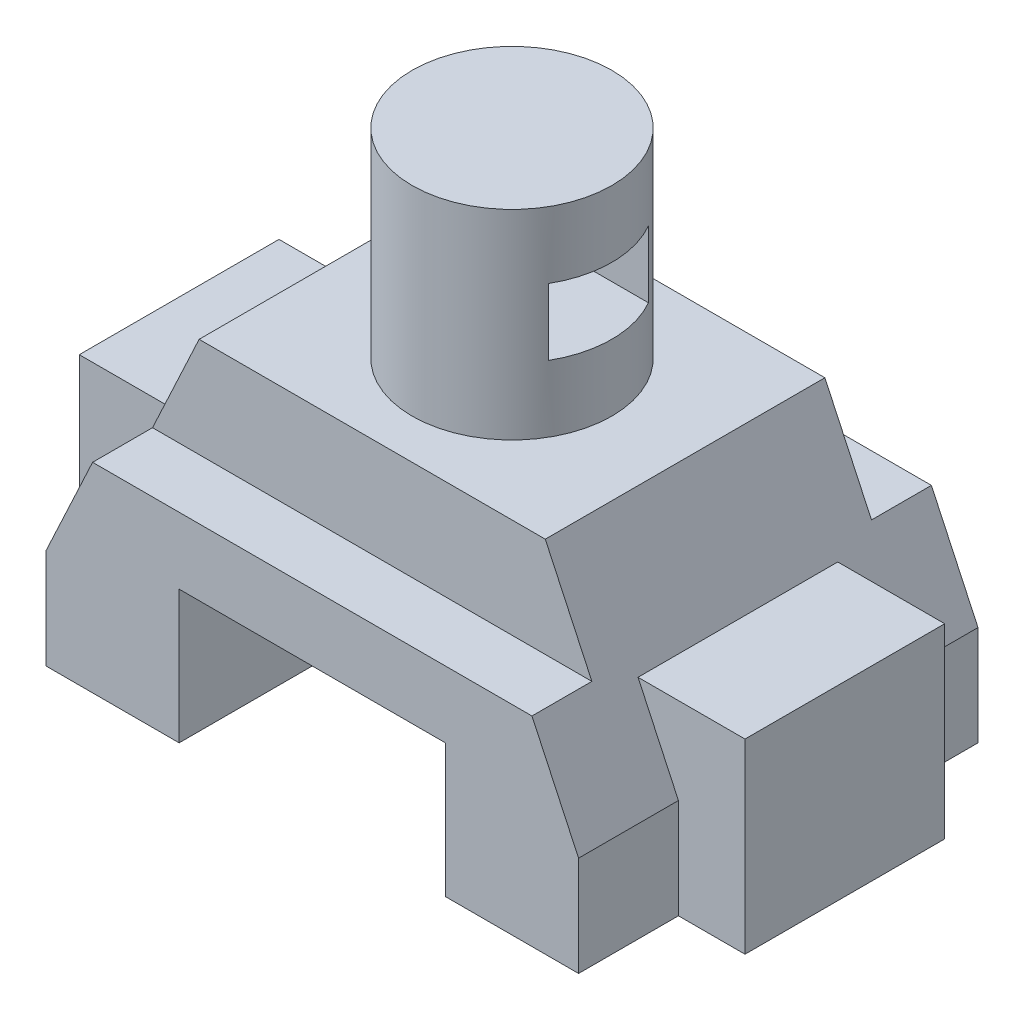
ISO-10303-21;
HEADER;
FILE_DESCRIPTION(('STEP AP214'),'2;1');
FILE_NAME('part.step','',(''),(''),'','','');
FILE_SCHEMA(('AUTOMOTIVE_DESIGN { 1 0 10303 214 1 1 1 1 }'));
ENDSEC;
DATA;
#1=APPLICATION_CONTEXT('core data for automotive mechanical design processes');
#2=APPLICATION_PROTOCOL_DEFINITION('international standard','automotive_design',2000,#1);
#3=PRODUCT_CONTEXT('',#1,'mechanical');
#4=PRODUCT('Part','Part','',(#3));
#5=PRODUCT_RELATED_PRODUCT_CATEGORY('part','',(#4));
#6=PRODUCT_DEFINITION_FORMATION('','',#4);
#7=PRODUCT_DEFINITION_CONTEXT('part definition',#1,'design');
#8=PRODUCT_DEFINITION('design','',#6,#7);
#9=PRODUCT_DEFINITION_SHAPE('','',#8);
#10=(LENGTH_UNIT() NAMED_UNIT(*) SI_UNIT(.MILLI.,.METRE.));
#11=(NAMED_UNIT(*) PLANE_ANGLE_UNIT() SI_UNIT($,.RADIAN.));
#12=(NAMED_UNIT(*) SI_UNIT($,.STERADIAN.) SOLID_ANGLE_UNIT());
#13=UNCERTAINTY_MEASURE_WITH_UNIT(LENGTH_MEASURE(1.E-05),#10,'distance_accuracy_value','');
#14=(GEOMETRIC_REPRESENTATION_CONTEXT(3) GLOBAL_UNCERTAINTY_ASSIGNED_CONTEXT((#13)) GLOBAL_UNIT_ASSIGNED_CONTEXT((#10,
#11,#12)) REPRESENTATION_CONTEXT('',''));
#15=CARTESIAN_POINT('',(0.,0.,0.));
#16=DIRECTION('',(0.,0.,1.));
#17=DIRECTION('',(1.,0.,0.));
#18=AXIS2_PLACEMENT_3D('',#15,#16,#17);
#19=CARTESIAN_POINT('',(40.,0.,60.));
#20=DIRECTION('',(0.,1.,0.));
#21=DIRECTION('',(-1.,0.,0.));
#22=AXIS2_PLACEMENT_3D('',#19,#20,#21);
#23=PLANE('',#22);
#24=DIRECTION('',(0.,0.,-1.));
#25=VECTOR('',#24,1.);
#26=CARTESIAN_POINT('',(20.,0.,60.));
#27=LINE('',#26,#25);
#28=CARTESIAN_POINT('',(20.,0.,60.));
#29=VERTEX_POINT('',#28);
#30=CARTESIAN_POINT('',(20.,0.,0.));
#31=VERTEX_POINT('',#30);
#32=EDGE_CURVE('E282',#29,#31,#27,.T.);
#33=ORIENTED_EDGE('',*,*,#32,.T.);
#34=DIRECTION('',(1.,0.,0.));
#35=VECTOR('',#34,1.);
#36=CARTESIAN_POINT('',(40.,0.,0.));
#37=LINE('',#36,#35);
#38=CARTESIAN_POINT('',(40.,0.,0.));
#39=VERTEX_POINT('',#38);
#40=EDGE_CURVE('E288',#31,#39,#37,.T.);
#41=ORIENTED_EDGE('',*,*,#40,.T.);
#42=DIRECTION('',(0.,0.,-1.));
#43=VECTOR('',#42,1.);
#44=CARTESIAN_POINT('',(40.,0.,60.));
#45=LINE('',#44,#43);
#46=CARTESIAN_POINT('',(40.,0.,15.));
#47=VERTEX_POINT('',#46);
#48=EDGE_CURVE('E287',#47,#39,#45,.T.);
#49=ORIENTED_EDGE('',*,*,#48,.F.);
#50=DIRECTION('',(1.,0.,0.));
#51=VECTOR('',#50,1.);
#52=CARTESIAN_POINT('',(-50.,0.,15.));
#53=LINE('',#52,#51);
#54=CARTESIAN_POINT('',(50.,0.,15.));
#55=VERTEX_POINT('',#54);
#56=EDGE_CURVE('E396',#47,#55,#53,.T.);
#57=ORIENTED_EDGE('',*,*,#56,.T.);
#58=DIRECTION('',(0.,0.,-1.));
#59=VECTOR('',#58,1.);
#60=CARTESIAN_POINT('',(50.,0.,45.));
#61=LINE('',#60,#59);
#62=CARTESIAN_POINT('',(50.,0.,45.));
#63=VERTEX_POINT('',#62);
#64=EDGE_CURVE('E425',#63,#55,#61,.T.);
#65=ORIENTED_EDGE('',*,*,#64,.F.);
#66=DIRECTION('',(1.,0.,0.));
#67=VECTOR('',#66,1.);
#68=CARTESIAN_POINT('',(-50.,0.,45.));
#69=LINE('',#68,#67);
#70=CARTESIAN_POINT('',(40.,0.,45.));
#71=VERTEX_POINT('',#70);
#72=EDGE_CURVE('E397',#71,#63,#69,.T.);
#73=ORIENTED_EDGE('',*,*,#72,.F.);
#74=CARTESIAN_POINT('',(40.,0.,60.));
#75=VERTEX_POINT('',#74);
#76=EDGE_CURVE('E284',#75,#71,#45,.T.);
#77=ORIENTED_EDGE('',*,*,#76,.F.);
#78=DIRECTION('',(1.,0.,0.));
#79=VECTOR('',#78,1.);
#80=CARTESIAN_POINT('',(40.,0.,60.));
#81=LINE('',#80,#79);
#82=EDGE_CURVE('E317',#29,#75,#81,.T.);
#83=ORIENTED_EDGE('',*,*,#82,.F.);
#84=EDGE_LOOP('',(#33,#41,#49,#57,#65,#73,#77,#83));
#85=FACE_BOUND('',#84,.T.);
#86=ADVANCED_FACE('F33',(#85),#23,.F.);
#87=CARTESIAN_POINT('',(40.,15.,60.));
#88=DIRECTION('',(-1.,0.,0.));
#89=DIRECTION('',(0.,0.,1.));
#90=AXIS2_PLACEMENT_3D('',#87,#88,#89);
#91=PLANE('',#90);
#92=ORIENTED_EDGE('',*,*,#76,.T.);
#93=DIRECTION('',(0.,1.,0.));
#94=VECTOR('',#93,1.);
#95=CARTESIAN_POINT('',(40.,15.,45.));
#96=LINE('',#95,#94);
#97=CARTESIAN_POINT('',(40.,15.,45.));
#98=VERTEX_POINT('',#97);
#99=EDGE_CURVE('E369',#71,#98,#96,.T.);
#100=ORIENTED_EDGE('',*,*,#99,.T.);
#101=DIRECTION('',(0.,0.,-1.));
#102=VECTOR('',#101,1.);
#103=CARTESIAN_POINT('',(40.,15.,60.));
#104=LINE('',#103,#102);
#105=CARTESIAN_POINT('',(40.,15.,60.));
#106=VERTEX_POINT('',#105);
#107=EDGE_CURVE('E258',#106,#98,#104,.T.);
#108=ORIENTED_EDGE('',*,*,#107,.F.);
#109=DIRECTION('',(0.,1.,0.));
#110=VECTOR('',#109,1.);
#111=CARTESIAN_POINT('',(40.,15.,60.));
#112=LINE('',#111,#110);
#113=EDGE_CURVE('E291',#75,#106,#112,.T.);
#114=ORIENTED_EDGE('',*,*,#113,.F.);
#115=EDGE_LOOP('',(#92,#100,#108,#114));
#116=FACE_BOUND('',#115,.T.);
#117=ADVANCED_FACE('F510',(#116),#91,.F.);
#118=CARTESIAN_POINT('',(-40.,0.,60.));
#119=DIRECTION('',(1.,0.,0.));
#120=DIRECTION('',(0.,0.,-1.));
#121=AXIS2_PLACEMENT_3D('',#118,#119,#120);
#122=PLANE('',#121);
#123=DIRECTION('',(0.,0.,-1.));
#124=VECTOR('',#123,1.);
#125=CARTESIAN_POINT('',(-40.,15.,60.));
#126=LINE('',#125,#124);
#127=CARTESIAN_POINT('',(-40.,15.,60.));
#128=VERTEX_POINT('',#127);
#129=CARTESIAN_POINT('',(-40.,15.,45.));
#130=VERTEX_POINT('',#129);
#131=EDGE_CURVE('E268',#128,#130,#126,.T.);
#132=ORIENTED_EDGE('',*,*,#131,.T.);
#133=DIRECTION('',(0.,-1.,0.));
#134=VECTOR('',#133,1.);
#135=CARTESIAN_POINT('',(-40.,0.,45.));
#136=LINE('',#135,#134);
#137=CARTESIAN_POINT('',(-40.,0.,45.));
#138=VERTEX_POINT('',#137);
#139=EDGE_CURVE('E378',#130,#138,#136,.T.);
#140=ORIENTED_EDGE('',*,*,#139,.T.);
#141=DIRECTION('',(0.,0.,-1.));
#142=VECTOR('',#141,1.);
#143=CARTESIAN_POINT('',(-40.,0.,60.));
#144=LINE('',#143,#142);
#145=CARTESIAN_POINT('',(-40.,0.,60.));
#146=VERTEX_POINT('',#145);
#147=EDGE_CURVE('E272',#146,#138,#144,.T.);
#148=ORIENTED_EDGE('',*,*,#147,.F.);
#149=DIRECTION('',(0.,-1.,0.));
#150=VECTOR('',#149,1.);
#151=CARTESIAN_POINT('',(-40.,0.,60.));
#152=LINE('',#151,#150);
#153=EDGE_CURVE('E327',#128,#146,#152,.T.);
#154=ORIENTED_EDGE('',*,*,#153,.F.);
#155=EDGE_LOOP('',(#132,#140,#148,#154));
#156=FACE_BOUND('',#155,.T.);
#157=ADVANCED_FACE('F497',(#156),#122,.F.);
#158=CARTESIAN_POINT('',(0.,0.,0.));
#159=DIRECTION('',(0.,0.,-1.));
#160=DIRECTION('',(-1.,0.,0.));
#161=AXIS2_PLACEMENT_3D('',#158,#159,#160);
#162=PLANE('',#161);
#163=DIRECTION('',(-0.422885465331124,-0.906183139995265,0.));
#164=VECTOR('',#163,1.);
#165=CARTESIAN_POINT('',(-40.,15.,0.));
#166=LINE('',#165,#164);
#167=CARTESIAN_POINT('',(-33.,30.,0.));
#168=VERTEX_POINT('',#167);
#169=CARTESIAN_POINT('',(-40.,15.,0.));
#170=VERTEX_POINT('',#169);
#171=EDGE_CURVE('E307',#168,#170,#166,.T.);
#172=ORIENTED_EDGE('',*,*,#171,.F.);
#173=DIRECTION('',(1.,0.,0.));
#174=VECTOR('',#173,1.);
#175=CARTESIAN_POINT('',(0.,30.,0.));
#176=LINE('',#175,#174);
#177=CARTESIAN_POINT('',(33.,30.,0.));
#178=VERTEX_POINT('',#177);
#179=EDGE_CURVE('E255',#168,#178,#176,.T.);
#180=ORIENTED_EDGE('',*,*,#179,.T.);
#181=DIRECTION('',(-0.422885465331124,0.906183139995265,0.));
#182=VECTOR('',#181,1.);
#183=CARTESIAN_POINT('',(26.,45.,0.));
#184=LINE('',#183,#182);
#185=CARTESIAN_POINT('',(40.,15.,0.));
#186=VERTEX_POINT('',#185);
#187=EDGE_CURVE('E310',#186,#178,#184,.T.);
#188=ORIENTED_EDGE('',*,*,#187,.F.);
#189=DIRECTION('',(0.,1.,0.));
#190=VECTOR('',#189,1.);
#191=CARTESIAN_POINT('',(40.,15.,0.));
#192=LINE('',#191,#190);
#193=EDGE_CURVE('E313',#39,#186,#192,.T.);
#194=ORIENTED_EDGE('',*,*,#193,.F.);
#195=ORIENTED_EDGE('',*,*,#40,.F.);
#196=DIRECTION('',(0.,-1.,0.));
#197=VECTOR('',#196,1.);
#198=CARTESIAN_POINT('',(20.,20.,0.));
#199=LINE('',#198,#197);
#200=CARTESIAN_POINT('',(20.,20.,0.));
#201=VERTEX_POINT('',#200);
#202=EDGE_CURVE('E292',#201,#31,#199,.T.);
#203=ORIENTED_EDGE('',*,*,#202,.F.);
#204=DIRECTION('',(1.,0.,0.));
#205=VECTOR('',#204,1.);
#206=CARTESIAN_POINT('',(-20.,20.,0.));
#207=LINE('',#206,#205);
#208=CARTESIAN_POINT('',(-20.,20.,0.));
#209=VERTEX_POINT('',#208);
#210=EDGE_CURVE('E295',#209,#201,#207,.T.);
#211=ORIENTED_EDGE('',*,*,#210,.F.);
#212=DIRECTION('',(0.,1.,0.));
#213=VECTOR('',#212,1.);
#214=CARTESIAN_POINT('',(-20.,0.,0.));
#215=LINE('',#214,#213);
#216=CARTESIAN_POINT('',(-20.,0.,0.));
#217=VERTEX_POINT('',#216);
#218=EDGE_CURVE('E298',#217,#209,#215,.T.);
#219=ORIENTED_EDGE('',*,*,#218,.F.);
#220=DIRECTION('',(1.,0.,0.));
#221=VECTOR('',#220,1.);
#222=CARTESIAN_POINT('',(-20.,0.,0.));
#223=LINE('',#222,#221);
#224=CARTESIAN_POINT('',(-40.,0.,0.));
#225=VERTEX_POINT('',#224);
#226=EDGE_CURVE('E301',#225,#217,#223,.T.);
#227=ORIENTED_EDGE('',*,*,#226,.F.);
#228=DIRECTION('',(0.,-1.,0.));
#229=VECTOR('',#228,1.);
#230=CARTESIAN_POINT('',(-40.,0.,0.));
#231=LINE('',#230,#229);
#232=EDGE_CURVE('E304',#170,#225,#231,.T.);
#233=ORIENTED_EDGE('',*,*,#232,.F.);
#234=EDGE_LOOP('',(#172,#180,#188,#194,#195,#203,#211,#219,#227,#233));
#235=FACE_BOUND('',#234,.T.);
#236=ADVANCED_FACE('F472',(#235),#162,.T.);
#237=CARTESIAN_POINT('',(40.,15.,15.));
#238=VERTEX_POINT('',#237);
#239=EDGE_CURVE('E261',#238,#186,#104,.T.);
#240=ORIENTED_EDGE('',*,*,#239,.F.);
#241=DIRECTION('',(0.,-1.,0.));
#242=VECTOR('',#241,1.);
#243=CARTESIAN_POINT('',(40.,15.,15.));
#244=LINE('',#243,#242);
#245=EDGE_CURVE('E381',#238,#47,#244,.T.);
#246=ORIENTED_EDGE('',*,*,#245,.T.);
#247=ORIENTED_EDGE('',*,*,#48,.T.);
#248=ORIENTED_EDGE('',*,*,#193,.T.);
#249=EDGE_LOOP('',(#240,#246,#247,#248));
#250=FACE_BOUND('',#249,.T.);
#251=ADVANCED_FACE('F35',(#250),#91,.F.);
#252=CARTESIAN_POINT('',(26.,45.,60.));
#253=DIRECTION('',(-0.906183139995265,-0.422885465331124,0.));
#254=DIRECTION('',(0.422885465331124,-0.906183139995265,0.));
#255=AXIS2_PLACEMENT_3D('',#252,#253,#254);
#256=PLANE('',#255);
#257=ORIENTED_EDGE('',*,*,#107,.T.);
#258=DIRECTION('',(-0.422885465331124,0.906183139995265,0.));
#259=VECTOR('',#258,1.);
#260=CARTESIAN_POINT('',(26.,45.,45.));
#261=LINE('',#260,#259);
#262=CARTESIAN_POINT('',(33.9333333333333,28.,45.));
#263=VERTEX_POINT('',#262);
#264=EDGE_CURVE('E372',#98,#263,#261,.T.);
#265=ORIENTED_EDGE('',*,*,#264,.T.);
#266=DIRECTION('',(0.,0.,-1.));
#267=VECTOR('',#266,1.);
#268=CARTESIAN_POINT('',(33.9333333333333,28.,60.));
#269=LINE('',#268,#267);
#270=CARTESIAN_POINT('',(33.9333333333333,28.,15.));
#271=VERTEX_POINT('',#270);
#272=EDGE_CURVE('E366',#263,#271,#269,.T.);
#273=ORIENTED_EDGE('',*,*,#272,.T.);
#274=DIRECTION('',(0.422885465331124,-0.906183139995265,0.));
#275=VECTOR('',#274,1.);
#276=CARTESIAN_POINT('',(26.,45.,15.));
#277=LINE('',#276,#275);
#278=EDGE_CURVE('E384',#271,#238,#277,.T.);
#279=ORIENTED_EDGE('',*,*,#278,.T.);
#280=ORIENTED_EDGE('',*,*,#239,.T.);
#281=ORIENTED_EDGE('',*,*,#187,.T.);
#282=DIRECTION('',(0.,0.,-1.));
#283=VECTOR('',#282,1.);
#284=CARTESIAN_POINT('',(33.,30.,60.));
#285=LINE('',#284,#283);
#286=CARTESIAN_POINT('',(33.,30.,9.));
#287=VERTEX_POINT('',#286);
#288=EDGE_CURVE('E347',#287,#178,#285,.T.);
#289=ORIENTED_EDGE('',*,*,#288,.F.);
#290=DIRECTION('',(-0.422885465331124,0.906183139995265,0.));
#291=VECTOR('',#290,1.);
#292=CARTESIAN_POINT('',(26.,45.,9.));
#293=LINE('',#292,#291);
#294=CARTESIAN_POINT('',(26.,45.,9.));
#295=VERTEX_POINT('',#294);
#296=EDGE_CURVE('E316',#287,#295,#293,.T.);
#297=ORIENTED_EDGE('',*,*,#296,.T.);
#298=DIRECTION('',(0.,0.,-1.));
#299=VECTOR('',#298,1.);
#300=CARTESIAN_POINT('',(26.,45.,60.));
#301=LINE('',#300,#299);
#302=CARTESIAN_POINT('',(26.,45.,51.));
#303=VERTEX_POINT('',#302);
#304=EDGE_CURVE('E262',#303,#295,#301,.T.);
#305=ORIENTED_EDGE('',*,*,#304,.F.);
#306=DIRECTION('',(0.422885465331124,-0.906183139995265,0.));
#307=VECTOR('',#306,1.);
#308=CARTESIAN_POINT('',(26.,45.,51.));
#309=LINE('',#308,#307);
#310=CARTESIAN_POINT('',(33.,30.,51.));
#311=VERTEX_POINT('',#310);
#312=EDGE_CURVE('E338',#303,#311,#309,.T.);
#313=ORIENTED_EDGE('',*,*,#312,.T.);
#314=DIRECTION('',(0.,0.,1.));
#315=VECTOR('',#314,1.);
#316=CARTESIAN_POINT('',(33.,30.,60.));
#317=LINE('',#316,#315);
#318=CARTESIAN_POINT('',(33.,30.,60.));
#319=VERTEX_POINT('',#318);
#320=EDGE_CURVE('E341',#311,#319,#317,.T.);
#321=ORIENTED_EDGE('',*,*,#320,.T.);
#322=DIRECTION('',(-0.422885465331124,0.906183139995265,0.));
#323=VECTOR('',#322,1.);
#324=CARTESIAN_POINT('',(26.,45.,60.));
#325=LINE('',#324,#323);
#326=EDGE_CURVE('E331',#106,#319,#325,.T.);
#327=ORIENTED_EDGE('',*,*,#326,.F.);
#328=EDGE_LOOP('',(#257,#265,#273,#279,#280,#281,#289,#297,#305,#313,#321,#327));
#329=FACE_BOUND('',#328,.T.);
#330=ADVANCED_FACE('F453',(#329),#256,.F.);
#331=CARTESIAN_POINT('',(-26.,45.,60.));
#332=DIRECTION('',(0.,-1.,0.));
#333=DIRECTION('',(0.,0.,-1.));
#334=AXIS2_PLACEMENT_3D('',#331,#332,#333);
#335=PLANE('',#334);
#336=CARTESIAN_POINT('',(0.,45.,30.));
#337=DIRECTION('',(0.,1.,0.));
#338=DIRECTION('',(0.,0.,1.));
#339=AXIS2_PLACEMENT_3D('',#336,#337,#338);
#340=CIRCLE('',#339,15.);
#341=CARTESIAN_POINT('',(0.,45.,45.));
#342=VERTEX_POINT('',#341);
#343=EDGE_CURVE('E245',#342,#342,#340,.T.);
#344=ORIENTED_EDGE('',*,*,#343,.F.);
#345=EDGE_LOOP('',(#344));
#346=FACE_BOUND('',#345,.T.);
#347=ORIENTED_EDGE('',*,*,#304,.T.);
#348=DIRECTION('',(1.,0.,0.));
#349=VECTOR('',#348,1.);
#350=CARTESIAN_POINT('',(-40.,45.,9.));
#351=LINE('',#350,#349);
#352=CARTESIAN_POINT('',(-26.,45.,9.));
#353=VERTEX_POINT('',#352);
#354=EDGE_CURVE('E358',#353,#295,#351,.T.);
#355=ORIENTED_EDGE('',*,*,#354,.F.);
#356=DIRECTION('',(0.,0.,-1.));
#357=VECTOR('',#356,1.);
#358=CARTESIAN_POINT('',(-26.,45.,60.));
#359=LINE('',#358,#357);
#360=CARTESIAN_POINT('',(-26.,45.,51.));
#361=VERTEX_POINT('',#360);
#362=EDGE_CURVE('E265',#361,#353,#359,.T.);
#363=ORIENTED_EDGE('',*,*,#362,.F.);
#364=DIRECTION('',(-1.,0.,0.));
#365=VECTOR('',#364,1.);
#366=CARTESIAN_POINT('',(-40.,45.,51.));
#367=LINE('',#366,#365);
#368=EDGE_CURVE('E352',#303,#361,#367,.T.);
#369=ORIENTED_EDGE('',*,*,#368,.F.);
#370=EDGE_LOOP('',(#347,#355,#363,#369));
#371=FACE_BOUND('',#370,.T.);
#372=ADVANCED_FACE('F449',(#346,#371),#335,.F.);
#373=CARTESIAN_POINT('',(-40.,15.,60.));
#374=DIRECTION('',(0.906183139995265,-0.422885465331124,0.));
#375=DIRECTION('',(0.422885465331124,0.906183139995265,0.));
#376=AXIS2_PLACEMENT_3D('',#373,#374,#375);
#377=PLANE('',#376);
#378=DIRECTION('',(0.,0.,1.));
#379=VECTOR('',#378,1.);
#380=CARTESIAN_POINT('',(-33.9333333333333,28.,60.));
#381=LINE('',#380,#379);
#382=CARTESIAN_POINT('',(-33.9333333333333,28.,15.));
#383=VERTEX_POINT('',#382);
#384=CARTESIAN_POINT('',(-33.9333333333333,28.,45.));
#385=VERTEX_POINT('',#384);
#386=EDGE_CURVE('E242',#383,#385,#381,.T.);
#387=ORIENTED_EDGE('',*,*,#386,.T.);
#388=DIRECTION('',(-0.422885465331124,-0.906183139995265,0.));
#389=VECTOR('',#388,1.);
#390=CARTESIAN_POINT('',(-40.,15.,45.));
#391=LINE('',#390,#389);
#392=EDGE_CURVE('E375',#385,#130,#391,.T.);
#393=ORIENTED_EDGE('',*,*,#392,.T.);
#394=ORIENTED_EDGE('',*,*,#131,.F.);
#395=DIRECTION('',(-0.422885465331124,-0.906183139995265,0.));
#396=VECTOR('',#395,1.);
#397=CARTESIAN_POINT('',(-40.,15.,60.));
#398=LINE('',#397,#396);
#399=CARTESIAN_POINT('',(-33.,30.,60.));
#400=VERTEX_POINT('',#399);
#401=EDGE_CURVE('E329',#400,#128,#398,.T.);
#402=ORIENTED_EDGE('',*,*,#401,.F.);
#403=DIRECTION('',(0.,0.,-1.));
#404=VECTOR('',#403,1.);
#405=CARTESIAN_POINT('',(-33.,30.,60.));
#406=LINE('',#405,#404);
#407=CARTESIAN_POINT('',(-33.,30.,51.));
#408=VERTEX_POINT('',#407);
#409=EDGE_CURVE('E344',#400,#408,#406,.T.);
#410=ORIENTED_EDGE('',*,*,#409,.T.);
#411=DIRECTION('',(0.422885465331124,0.906183139995265,0.));
#412=VECTOR('',#411,1.);
#413=CARTESIAN_POINT('',(-40.,15.,51.));
#414=LINE('',#413,#412);
#415=EDGE_CURVE('E249',#408,#361,#414,.T.);
#416=ORIENTED_EDGE('',*,*,#415,.T.);
#417=ORIENTED_EDGE('',*,*,#362,.T.);
#418=DIRECTION('',(-0.422885465331124,-0.906183139995265,0.));
#419=VECTOR('',#418,1.);
#420=CARTESIAN_POINT('',(-40.,15.,9.));
#421=LINE('',#420,#419);
#422=CARTESIAN_POINT('',(-33.,30.,9.));
#423=VERTEX_POINT('',#422);
#424=EDGE_CURVE('E246',#353,#423,#421,.T.);
#425=ORIENTED_EDGE('',*,*,#424,.T.);
#426=DIRECTION('',(0.,0.,1.));
#427=VECTOR('',#426,1.);
#428=CARTESIAN_POINT('',(-33.,30.,60.));
#429=LINE('',#428,#427);
#430=EDGE_CURVE('E349',#168,#423,#429,.T.);
#431=ORIENTED_EDGE('',*,*,#430,.F.);
#432=ORIENTED_EDGE('',*,*,#171,.T.);
#433=CARTESIAN_POINT('',(-40.,15.,15.));
#434=VERTEX_POINT('',#433);
#435=EDGE_CURVE('E271',#434,#170,#126,.T.);
#436=ORIENTED_EDGE('',*,*,#435,.F.);
#437=DIRECTION('',(0.422885465331124,0.906183139995265,0.));
#438=VECTOR('',#437,1.);
#439=CARTESIAN_POINT('',(-40.,15.,15.));
#440=LINE('',#439,#438);
#441=EDGE_CURVE('E387',#434,#383,#440,.T.);
#442=ORIENTED_EDGE('',*,*,#441,.T.);
#443=EDGE_LOOP('',(#387,#393,#394,#402,#410,#416,#417,#425,#431,#432,#436,#442));
#444=FACE_BOUND('',#443,.T.);
#445=ADVANCED_FACE('F452',(#444),#377,.F.);
#446=CARTESIAN_POINT('',(-40.,0.,15.));
#447=VERTEX_POINT('',#446);
#448=EDGE_CURVE('E275',#447,#225,#144,.T.);
#449=ORIENTED_EDGE('',*,*,#448,.F.);
#450=DIRECTION('',(0.,1.,0.));
#451=VECTOR('',#450,1.);
#452=CARTESIAN_POINT('',(-40.,0.,15.));
#453=LINE('',#452,#451);
#454=EDGE_CURVE('E390',#447,#434,#453,.T.);
#455=ORIENTED_EDGE('',*,*,#454,.T.);
#456=ORIENTED_EDGE('',*,*,#435,.T.);
#457=ORIENTED_EDGE('',*,*,#232,.T.);
#458=EDGE_LOOP('',(#449,#455,#456,#457));
#459=FACE_BOUND('',#458,.T.);
#460=ADVANCED_FACE('F478',(#459),#122,.F.);
#461=CARTESIAN_POINT('',(-20.,0.,60.));
#462=DIRECTION('',(-1.,0.,0.));
#463=DIRECTION('',(0.,0.,1.));
#464=AXIS2_PLACEMENT_3D('',#461,#462,#463);
#465=PLANE('',#464);
#466=ORIENTED_EDGE('',*,*,#218,.T.);
#467=DIRECTION('',(0.,0.,-1.));
#468=VECTOR('',#467,1.);
#469=CARTESIAN_POINT('',(-20.,20.,60.));
#470=LINE('',#469,#468);
#471=CARTESIAN_POINT('',(-20.,20.,60.));
#472=VERTEX_POINT('',#471);
#473=EDGE_CURVE('E278',#472,#209,#470,.T.);
#474=ORIENTED_EDGE('',*,*,#473,.F.);
#475=DIRECTION('',(0.,1.,0.));
#476=VECTOR('',#475,1.);
#477=CARTESIAN_POINT('',(-20.,0.,60.));
#478=LINE('',#477,#476);
#479=CARTESIAN_POINT('',(-20.,0.,60.));
#480=VERTEX_POINT('',#479);
#481=EDGE_CURVE('E323',#480,#472,#478,.T.);
#482=ORIENTED_EDGE('',*,*,#481,.F.);
#483=DIRECTION('',(0.,0.,-1.));
#484=VECTOR('',#483,1.);
#485=CARTESIAN_POINT('',(-20.,0.,60.));
#486=LINE('',#485,#484);
#487=EDGE_CURVE('E276',#480,#217,#486,.T.);
#488=ORIENTED_EDGE('',*,*,#487,.T.);
#489=EDGE_LOOP('',(#466,#474,#482,#488));
#490=FACE_BOUND('',#489,.T.);
#491=ADVANCED_FACE('F545',(#490),#465,.F.);
#492=CARTESIAN_POINT('',(-20.,20.,60.));
#493=DIRECTION('',(0.,1.,0.));
#494=DIRECTION('',(0.,0.,1.));
#495=AXIS2_PLACEMENT_3D('',#492,#493,#494);
#496=PLANE('',#495);
#497=ORIENTED_EDGE('',*,*,#210,.T.);
#498=DIRECTION('',(0.,0.,-1.));
#499=VECTOR('',#498,1.);
#500=CARTESIAN_POINT('',(20.,20.,60.));
#501=LINE('',#500,#499);
#502=CARTESIAN_POINT('',(20.,20.,60.));
#503=VERTEX_POINT('',#502);
#504=EDGE_CURVE('E280',#503,#201,#501,.T.);
#505=ORIENTED_EDGE('',*,*,#504,.F.);
#506=DIRECTION('',(1.,0.,0.));
#507=VECTOR('',#506,1.);
#508=CARTESIAN_POINT('',(-20.,20.,60.));
#509=LINE('',#508,#507);
#510=EDGE_CURVE('E321',#472,#503,#509,.T.);
#511=ORIENTED_EDGE('',*,*,#510,.F.);
#512=ORIENTED_EDGE('',*,*,#473,.T.);
#513=EDGE_LOOP('',(#497,#505,#511,#512));
#514=FACE_BOUND('',#513,.T.);
#515=ADVANCED_FACE('F541',(#514),#496,.F.);
#516=CARTESIAN_POINT('',(20.,20.,60.));
#517=DIRECTION('',(1.,0.,0.));
#518=DIRECTION('',(0.,1.,0.));
#519=AXIS2_PLACEMENT_3D('',#516,#517,#518);
#520=PLANE('',#519);
#521=ORIENTED_EDGE('',*,*,#202,.T.);
#522=ORIENTED_EDGE('',*,*,#32,.F.);
#523=DIRECTION('',(0.,-1.,0.));
#524=VECTOR('',#523,1.);
#525=CARTESIAN_POINT('',(20.,20.,60.));
#526=LINE('',#525,#524);
#527=EDGE_CURVE('E319',#503,#29,#526,.T.);
#528=ORIENTED_EDGE('',*,*,#527,.F.);
#529=ORIENTED_EDGE('',*,*,#504,.T.);
#530=EDGE_LOOP('',(#521,#522,#528,#529));
#531=FACE_BOUND('',#530,.T.);
#532=ADVANCED_FACE('F536',(#531),#520,.F.);
#533=ORIENTED_EDGE('',*,*,#226,.T.);
#534=ORIENTED_EDGE('',*,*,#487,.F.);
#535=DIRECTION('',(1.,0.,0.));
#536=VECTOR('',#535,1.);
#537=CARTESIAN_POINT('',(-20.,0.,60.));
#538=LINE('',#537,#536);
#539=EDGE_CURVE('E325',#146,#480,#538,.T.);
#540=ORIENTED_EDGE('',*,*,#539,.F.);
#541=ORIENTED_EDGE('',*,*,#147,.T.);
#542=CARTESIAN_POINT('',(-50.,0.,45.));
#543=VERTEX_POINT('',#542);
#544=EDGE_CURVE('E394',#543,#138,#69,.T.);
#545=ORIENTED_EDGE('',*,*,#544,.F.);
#546=DIRECTION('',(0.,0.,-1.));
#547=VECTOR('',#546,1.);
#548=CARTESIAN_POINT('',(-50.,0.,45.));
#549=LINE('',#548,#547);
#550=CARTESIAN_POINT('',(-50.,0.,15.));
#551=VERTEX_POINT('',#550);
#552=EDGE_CURVE('E413',#543,#551,#549,.T.);
#553=ORIENTED_EDGE('',*,*,#552,.T.);
#554=EDGE_CURVE('E398',#551,#447,#53,.T.);
#555=ORIENTED_EDGE('',*,*,#554,.T.);
#556=ORIENTED_EDGE('',*,*,#448,.T.);
#557=EDGE_LOOP('',(#533,#534,#540,#541,#545,#553,#555,#556));
#558=FACE_BOUND('',#557,.T.);
#559=ADVANCED_FACE('F493',(#558),#23,.F.);
#560=CARTESIAN_POINT('',(0.,0.,60.));
#561=DIRECTION('',(0.,0.,-1.));
#562=DIRECTION('',(-1.,0.,0.));
#563=AXIS2_PLACEMENT_3D('',#560,#561,#562);
#564=PLANE('',#563);
#565=ORIENTED_EDGE('',*,*,#326,.T.);
#566=DIRECTION('',(-1.,0.,0.));
#567=VECTOR('',#566,1.);
#568=CARTESIAN_POINT('',(0.,30.,60.));
#569=LINE('',#568,#567);
#570=EDGE_CURVE('E252',#319,#400,#569,.T.);
#571=ORIENTED_EDGE('',*,*,#570,.T.);
#572=ORIENTED_EDGE('',*,*,#401,.T.);
#573=ORIENTED_EDGE('',*,*,#153,.T.);
#574=ORIENTED_EDGE('',*,*,#539,.T.);
#575=ORIENTED_EDGE('',*,*,#481,.T.);
#576=ORIENTED_EDGE('',*,*,#510,.T.);
#577=ORIENTED_EDGE('',*,*,#527,.T.);
#578=ORIENTED_EDGE('',*,*,#82,.T.);
#579=ORIENTED_EDGE('',*,*,#113,.T.);
#580=EDGE_LOOP('',(#565,#571,#572,#573,#574,#575,#576,#577,#578,#579));
#581=FACE_BOUND('',#580,.T.);
#582=ADVANCED_FACE('F502',(#581),#564,.F.);
#583=CARTESIAN_POINT('',(-40.,30.,9.));
#584=DIRECTION('',(0.,0.,1.));
#585=DIRECTION('',(1.,0.,0.));
#586=AXIS2_PLACEMENT_3D('',#583,#584,#585);
#587=PLANE('',#586);
#588=DIRECTION('',(1.,0.,0.));
#589=VECTOR('',#588,1.);
#590=CARTESIAN_POINT('',(-40.,30.,9.));
#591=LINE('',#590,#589);
#592=EDGE_CURVE('E351',#423,#287,#591,.T.);
#593=ORIENTED_EDGE('',*,*,#592,.F.);
#594=ORIENTED_EDGE('',*,*,#424,.F.);
#595=ORIENTED_EDGE('',*,*,#354,.T.);
#596=ORIENTED_EDGE('',*,*,#296,.F.);
#597=EDGE_LOOP('',(#593,#594,#595,#596));
#598=FACE_BOUND('',#597,.T.);
#599=ADVANCED_FACE('F463',(#598),#587,.F.);
#600=CARTESIAN_POINT('',(0.,30.,0.));
#601=DIRECTION('',(0.,1.,0.));
#602=DIRECTION('',(0.,0.,1.));
#603=AXIS2_PLACEMENT_3D('',#600,#601,#602);
#604=PLANE('',#603);
#605=ORIENTED_EDGE('',*,*,#288,.T.);
#606=ORIENTED_EDGE('',*,*,#179,.F.);
#607=ORIENTED_EDGE('',*,*,#430,.T.);
#608=ORIENTED_EDGE('',*,*,#592,.T.);
#609=EDGE_LOOP('',(#605,#606,#607,#608));
#610=FACE_BOUND('',#609,.T.);
#611=ADVANCED_FACE('F465',(#610),#604,.T.);
#612=CARTESIAN_POINT('',(-40.,30.,51.));
#613=DIRECTION('',(0.,0.,-1.));
#614=DIRECTION('',(-1.,0.,0.));
#615=AXIS2_PLACEMENT_3D('',#612,#613,#614);
#616=PLANE('',#615);
#617=ORIENTED_EDGE('',*,*,#368,.T.);
#618=ORIENTED_EDGE('',*,*,#415,.F.);
#619=DIRECTION('',(-1.,0.,0.));
#620=VECTOR('',#619,1.);
#621=CARTESIAN_POINT('',(-40.,30.,51.));
#622=LINE('',#621,#620);
#623=EDGE_CURVE('E354',#311,#408,#622,.T.);
#624=ORIENTED_EDGE('',*,*,#623,.F.);
#625=ORIENTED_EDGE('',*,*,#312,.F.);
#626=EDGE_LOOP('',(#617,#618,#624,#625));
#627=FACE_BOUND('',#626,.T.);
#628=ADVANCED_FACE('F717',(#627),#616,.F.);
#629=CARTESIAN_POINT('',(0.,30.,0.));
#630=DIRECTION('',(0.,-1.,0.));
#631=DIRECTION('',(0.,0.,-1.));
#632=AXIS2_PLACEMENT_3D('',#629,#630,#631);
#633=PLANE('',#632);
#634=ORIENTED_EDGE('',*,*,#623,.T.);
#635=ORIENTED_EDGE('',*,*,#409,.F.);
#636=ORIENTED_EDGE('',*,*,#570,.F.);
#637=ORIENTED_EDGE('',*,*,#320,.F.);
#638=EDGE_LOOP('',(#634,#635,#636,#637));
#639=FACE_BOUND('',#638,.T.);
#640=ADVANCED_FACE('F443',(#639),#633,.F.);
#641=CARTESIAN_POINT('',(0.,75.,30.));
#642=DIRECTION('',(0.,-1.,0.));
#643=DIRECTION('',(0.,0.,-1.));
#644=AXIS2_PLACEMENT_3D('',#641,#642,#643);
#645=CYLINDRICAL_SURFACE('',#644,15.);
#646=CARTESIAN_POINT('',(0.,55.,30.));
#647=DIRECTION('',(0.,-1.,0.));
#648=DIRECTION('',(0.,0.,-1.));
#649=AXIS2_PLACEMENT_3D('',#646,#647,#648);
#650=CIRCLE('',#649,15.);
#651=CARTESIAN_POINT('',(12.9903810567666,55.,22.5));
#652=VERTEX_POINT('',#651);
#653=CARTESIAN_POINT('',(12.9903810567666,55.,37.5));
#654=VERTEX_POINT('',#653);
#655=EDGE_CURVE('E215',#652,#654,#650,.T.);
#656=ORIENTED_EDGE('',*,*,#655,.T.);
#657=DIRECTION('',(0.,-1.,0.));
#658=VECTOR('',#657,1.);
#659=CARTESIAN_POINT('',(12.9903810567666,75.,37.5));
#660=LINE('',#659,#658);
#661=CARTESIAN_POINT('',(12.9903810567666,65.,37.5));
#662=VERTEX_POINT('',#661);
#663=EDGE_CURVE('E11',#654,#662,#660,.F.);
#664=ORIENTED_EDGE('',*,*,#663,.T.);
#665=CARTESIAN_POINT('',(0.,65.,30.));
#666=DIRECTION('',(0.,1.,0.));
#667=DIRECTION('',(0.,0.,1.));
#668=AXIS2_PLACEMENT_3D('',#665,#666,#667);
#669=CIRCLE('',#668,15.);
#670=CARTESIAN_POINT('',(12.9903810567666,65.,22.5));
#671=VERTEX_POINT('',#670);
#672=EDGE_CURVE('E41',#662,#671,#669,.T.);
#673=ORIENTED_EDGE('',*,*,#672,.T.);
#674=DIRECTION('',(0.,-1.,0.));
#675=VECTOR('',#674,1.);
#676=CARTESIAN_POINT('',(12.9903810567666,75.,22.5));
#677=LINE('',#676,#675);
#678=EDGE_CURVE('E219',#671,#652,#677,.T.);
#679=ORIENTED_EDGE('',*,*,#678,.T.);
#680=EDGE_LOOP('',(#656,#664,#673,#679));
#681=FACE_BOUND('',#680,.T.);
#682=CARTESIAN_POINT('',(-12.9903810567666,65.,22.5));
#683=VERTEX_POINT('',#682);
#684=CARTESIAN_POINT('',(-12.9903810567666,65.,37.5));
#685=VERTEX_POINT('',#684);
#686=EDGE_CURVE('E236',#683,#685,#669,.T.);
#687=ORIENTED_EDGE('',*,*,#686,.T.);
#688=DIRECTION('',(0.,-1.,0.));
#689=VECTOR('',#688,1.);
#690=CARTESIAN_POINT('',(-12.9903810567666,75.,37.5));
#691=LINE('',#690,#689);
#692=CARTESIAN_POINT('',(-12.9903810567666,55.,37.5));
#693=VERTEX_POINT('',#692);
#694=EDGE_CURVE('E220',#685,#693,#691,.T.);
#695=ORIENTED_EDGE('',*,*,#694,.T.);
#696=CARTESIAN_POINT('',(-12.9903810567666,55.,22.5));
#697=VERTEX_POINT('',#696);
#698=EDGE_CURVE('E222',#693,#697,#650,.T.);
#699=ORIENTED_EDGE('',*,*,#698,.T.);
#700=DIRECTION('',(0.,-1.,0.));
#701=VECTOR('',#700,1.);
#702=CARTESIAN_POINT('',(-12.9903810567666,75.,22.5));
#703=LINE('',#702,#701);
#704=EDGE_CURVE('E228',#697,#683,#703,.F.);
#705=ORIENTED_EDGE('',*,*,#704,.T.);
#706=EDGE_LOOP('',(#687,#695,#699,#705));
#707=FACE_BOUND('',#706,.T.);
#708=CARTESIAN_POINT('',(0.,75.,30.));
#709=DIRECTION('',(0.,1.,0.));
#710=DIRECTION('',(0.,0.,1.));
#711=AXIS2_PLACEMENT_3D('',#708,#709,#710);
#712=CIRCLE('',#711,15.);
#713=CARTESIAN_POINT('',(0.,75.,45.));
#714=VERTEX_POINT('',#713);
#715=EDGE_CURVE('E355',#714,#714,#712,.T.);
#716=ORIENTED_EDGE('',*,*,#715,.F.);
#717=EDGE_LOOP('',(#716));
#718=FACE_BOUND('',#717,.T.);
#719=ORIENTED_EDGE('',*,*,#343,.T.);
#720=EDGE_LOOP('',(#719));
#721=FACE_BOUND('',#720,.T.);
#722=ADVANCED_FACE('F233',(#681,#707,#718,#721),#645,.T.);
#723=CARTESIAN_POINT('',(0.,75.,30.));
#724=DIRECTION('',(0.,1.,0.));
#725=DIRECTION('',(0.,0.,1.));
#726=AXIS2_PLACEMENT_3D('',#723,#724,#725);
#727=PLANE('',#726);
#728=ORIENTED_EDGE('',*,*,#715,.T.);
#729=EDGE_LOOP('',(#728));
#730=FACE_BOUND('',#729,.T.);
#731=ADVANCED_FACE('F442',(#730),#727,.T.);
#732=CARTESIAN_POINT('',(-50.,0.,0.));
#733=DIRECTION('',(-1.,0.,0.));
#734=DIRECTION('',(0.,0.,1.));
#735=AXIS2_PLACEMENT_3D('',#732,#733,#734);
#736=PLANE('',#735);
#737=DIRECTION('',(0.,-1.,0.));
#738=VECTOR('',#737,1.);
#739=CARTESIAN_POINT('',(-50.,0.,45.));
#740=LINE('',#739,#738);
#741=CARTESIAN_POINT('',(-50.,28.,45.));
#742=VERTEX_POINT('',#741);
#743=EDGE_CURVE('E416',#742,#543,#740,.T.);
#744=ORIENTED_EDGE('',*,*,#743,.F.);
#745=DIRECTION('',(0.,0.,1.));
#746=VECTOR('',#745,1.);
#747=CARTESIAN_POINT('',(-50.,28.,45.));
#748=LINE('',#747,#746);
#749=CARTESIAN_POINT('',(-50.,28.,15.));
#750=VERTEX_POINT('',#749);
#751=EDGE_CURVE('E407',#750,#742,#748,.T.);
#752=ORIENTED_EDGE('',*,*,#751,.F.);
#753=DIRECTION('',(0.,1.,0.));
#754=VECTOR('',#753,1.);
#755=CARTESIAN_POINT('',(-50.,0.,15.));
#756=LINE('',#755,#754);
#757=EDGE_CURVE('E410',#551,#750,#756,.T.);
#758=ORIENTED_EDGE('',*,*,#757,.F.);
#759=ORIENTED_EDGE('',*,*,#552,.F.);
#760=EDGE_LOOP('',(#744,#752,#758,#759));
#761=FACE_BOUND('',#760,.T.);
#762=ADVANCED_FACE('F491',(#761),#736,.T.);
#763=CARTESIAN_POINT('',(-50.,0.,15.));
#764=DIRECTION('',(0.,0.,-1.));
#765=DIRECTION('',(-1.,0.,0.));
#766=AXIS2_PLACEMENT_3D('',#763,#764,#765);
#767=PLANE('',#766);
#768=ORIENTED_EDGE('',*,*,#441,.F.);
#769=ORIENTED_EDGE('',*,*,#454,.F.);
#770=ORIENTED_EDGE('',*,*,#554,.F.);
#771=ORIENTED_EDGE('',*,*,#757,.T.);
#772=DIRECTION('',(1.,0.,0.));
#773=VECTOR('',#772,1.);
#774=CARTESIAN_POINT('',(-50.,28.,15.));
#775=LINE('',#774,#773);
#776=EDGE_CURVE('E401',#750,#383,#775,.T.);
#777=ORIENTED_EDGE('',*,*,#776,.T.);
#778=EDGE_LOOP('',(#768,#769,#770,#771,#777));
#779=FACE_BOUND('',#778,.T.);
#780=ADVANCED_FACE('F481',(#779),#767,.T.);
#781=CARTESIAN_POINT('',(-50.,0.,45.));
#782=DIRECTION('',(0.,0.,1.));
#783=DIRECTION('',(1.,0.,0.));
#784=AXIS2_PLACEMENT_3D('',#781,#782,#783);
#785=PLANE('',#784);
#786=ORIENTED_EDGE('',*,*,#392,.F.);
#787=DIRECTION('',(1.,0.,0.));
#788=VECTOR('',#787,1.);
#789=CARTESIAN_POINT('',(-50.,28.,45.));
#790=LINE('',#789,#788);
#791=EDGE_CURVE('E393',#742,#385,#790,.T.);
#792=ORIENTED_EDGE('',*,*,#791,.F.);
#793=ORIENTED_EDGE('',*,*,#743,.T.);
#794=ORIENTED_EDGE('',*,*,#544,.T.);
#795=ORIENTED_EDGE('',*,*,#139,.F.);
#796=EDGE_LOOP('',(#786,#792,#793,#794,#795));
#797=FACE_BOUND('',#796,.T.);
#798=ADVANCED_FACE('F488',(#797),#785,.T.);
#799=CARTESIAN_POINT('',(-50.,28.,45.));
#800=DIRECTION('',(0.,1.,0.));
#801=DIRECTION('',(0.,0.,1.));
#802=AXIS2_PLACEMENT_3D('',#799,#800,#801);
#803=PLANE('',#802);
#804=ORIENTED_EDGE('',*,*,#386,.F.);
#805=ORIENTED_EDGE('',*,*,#776,.F.);
#806=ORIENTED_EDGE('',*,*,#751,.T.);
#807=ORIENTED_EDGE('',*,*,#791,.T.);
#808=EDGE_LOOP('',(#804,#805,#806,#807));
#809=FACE_BOUND('',#808,.T.);
#810=ADVANCED_FACE('F485',(#809),#803,.T.);
#811=ORIENTED_EDGE('',*,*,#272,.F.);
#812=CARTESIAN_POINT('',(50.,28.,45.));
#813=VERTEX_POINT('',#812);
#814=EDGE_CURVE('E404',#263,#813,#790,.T.);
#815=ORIENTED_EDGE('',*,*,#814,.T.);
#816=DIRECTION('',(0.,0.,1.));
#817=VECTOR('',#816,1.);
#818=CARTESIAN_POINT('',(50.,28.,45.));
#819=LINE('',#818,#817);
#820=CARTESIAN_POINT('',(50.,28.,15.));
#821=VERTEX_POINT('',#820);
#822=EDGE_CURVE('E419',#821,#813,#819,.T.);
#823=ORIENTED_EDGE('',*,*,#822,.F.);
#824=EDGE_CURVE('E400',#271,#821,#775,.T.);
#825=ORIENTED_EDGE('',*,*,#824,.F.);
#826=EDGE_LOOP('',(#811,#815,#823,#825));
#827=FACE_BOUND('',#826,.T.);
#828=ADVANCED_FACE('F526',(#827),#803,.T.);
#829=ORIENTED_EDGE('',*,*,#99,.F.);
#830=ORIENTED_EDGE('',*,*,#72,.T.);
#831=DIRECTION('',(0.,-1.,0.));
#832=VECTOR('',#831,1.);
#833=CARTESIAN_POINT('',(50.,0.,45.));
#834=LINE('',#833,#832);
#835=EDGE_CURVE('E428',#813,#63,#834,.T.);
#836=ORIENTED_EDGE('',*,*,#835,.F.);
#837=ORIENTED_EDGE('',*,*,#814,.F.);
#838=ORIENTED_EDGE('',*,*,#264,.F.);
#839=EDGE_LOOP('',(#829,#830,#836,#837,#838));
#840=FACE_BOUND('',#839,.T.);
#841=ADVANCED_FACE('F513',(#840),#785,.T.);
#842=ORIENTED_EDGE('',*,*,#245,.F.);
#843=ORIENTED_EDGE('',*,*,#278,.F.);
#844=ORIENTED_EDGE('',*,*,#824,.T.);
#845=DIRECTION('',(0.,1.,0.));
#846=VECTOR('',#845,1.);
#847=CARTESIAN_POINT('',(50.,0.,15.));
#848=LINE('',#847,#846);
#849=EDGE_CURVE('E422',#55,#821,#848,.T.);
#850=ORIENTED_EDGE('',*,*,#849,.F.);
#851=ORIENTED_EDGE('',*,*,#56,.F.);
#852=EDGE_LOOP('',(#842,#843,#844,#850,#851));
#853=FACE_BOUND('',#852,.T.);
#854=ADVANCED_FACE('F528',(#853),#767,.T.);
#855=CARTESIAN_POINT('',(50.,0.,0.));
#856=DIRECTION('',(-1.,0.,0.));
#857=DIRECTION('',(0.,0.,1.));
#858=AXIS2_PLACEMENT_3D('',#855,#856,#857);
#859=PLANE('',#858);
#860=ORIENTED_EDGE('',*,*,#835,.T.);
#861=ORIENTED_EDGE('',*,*,#64,.T.);
#862=ORIENTED_EDGE('',*,*,#849,.T.);
#863=ORIENTED_EDGE('',*,*,#822,.T.);
#864=EDGE_LOOP('',(#860,#861,#862,#863));
#865=FACE_BOUND('',#864,.T.);
#866=ADVANCED_FACE('F521',(#865),#859,.F.);
#867=CARTESIAN_POINT('',(-50.,65.,37.5));
#868=DIRECTION('',(0.,0.,1.));
#869=DIRECTION('',(1.,0.,0.));
#870=AXIS2_PLACEMENT_3D('',#867,#868,#869);
#871=PLANE('',#870);
#872=DIRECTION('',(1.,0.,0.));
#873=VECTOR('',#872,1.);
#874=CARTESIAN_POINT('',(-50.,65.,37.5));
#875=LINE('',#874,#873);
#876=EDGE_CURVE('E431',#685,#662,#875,.T.);
#877=ORIENTED_EDGE('',*,*,#876,.T.);
#878=ORIENTED_EDGE('',*,*,#663,.F.);
#879=DIRECTION('',(1.,0.,0.));
#880=VECTOR('',#879,1.);
#881=CARTESIAN_POINT('',(-50.,55.,37.5));
#882=LINE('',#881,#880);
#883=EDGE_CURVE('E48',#693,#654,#882,.T.);
#884=ORIENTED_EDGE('',*,*,#883,.F.);
#885=ORIENTED_EDGE('',*,*,#694,.F.);
#886=EDGE_LOOP('',(#877,#878,#884,#885));
#887=FACE_BOUND('',#886,.T.);
#888=ADVANCED_FACE('F437',(#887),#871,.F.);
#889=CARTESIAN_POINT('',(-50.,65.,37.5));
#890=DIRECTION('',(0.,1.,0.));
#891=DIRECTION('',(0.,0.,1.));
#892=AXIS2_PLACEMENT_3D('',#889,#890,#891);
#893=PLANE('',#892);
#894=ORIENTED_EDGE('',*,*,#876,.F.);
#895=ORIENTED_EDGE('',*,*,#686,.F.);
#896=DIRECTION('',(1.,0.,0.));
#897=VECTOR('',#896,1.);
#898=CARTESIAN_POINT('',(-50.,65.,22.5));
#899=LINE('',#898,#897);
#900=EDGE_CURVE('E230',#683,#671,#899,.T.);
#901=ORIENTED_EDGE('',*,*,#900,.T.);
#902=ORIENTED_EDGE('',*,*,#672,.F.);
#903=EDGE_LOOP('',(#894,#895,#901,#902));
#904=FACE_BOUND('',#903,.T.);
#905=ADVANCED_FACE('F439',(#904),#893,.F.);
#906=CARTESIAN_POINT('',(-50.,65.,22.5));
#907=DIRECTION('',(0.,0.,-1.));
#908=DIRECTION('',(-1.,0.,0.));
#909=AXIS2_PLACEMENT_3D('',#906,#907,#908);
#910=PLANE('',#909);
#911=ORIENTED_EDGE('',*,*,#900,.F.);
#912=ORIENTED_EDGE('',*,*,#704,.F.);
#913=DIRECTION('',(1.,0.,0.));
#914=VECTOR('',#913,1.);
#915=CARTESIAN_POINT('',(-50.,55.,22.5));
#916=LINE('',#915,#914);
#917=EDGE_CURVE('E53',#697,#652,#916,.T.);
#918=ORIENTED_EDGE('',*,*,#917,.T.);
#919=ORIENTED_EDGE('',*,*,#678,.F.);
#920=EDGE_LOOP('',(#911,#912,#918,#919));
#921=FACE_BOUND('',#920,.T.);
#922=ADVANCED_FACE('F225',(#921),#910,.F.);
#923=CARTESIAN_POINT('',(-50.,55.,37.5));
#924=DIRECTION('',(0.,-1.,0.));
#925=DIRECTION('',(0.,0.,-1.));
#926=AXIS2_PLACEMENT_3D('',#923,#924,#925);
#927=PLANE('',#926);
#928=ORIENTED_EDGE('',*,*,#917,.F.);
#929=ORIENTED_EDGE('',*,*,#698,.F.);
#930=ORIENTED_EDGE('',*,*,#883,.T.);
#931=ORIENTED_EDGE('',*,*,#655,.F.);
#932=EDGE_LOOP('',(#928,#929,#930,#931));
#933=FACE_BOUND('',#932,.T.);
#934=ADVANCED_FACE('F216',(#933),#927,.F.);
#935=CLOSED_SHELL('',(#86,#117,#157,#236,#251,#330,#372,#445,#460,#491,#515,#532,#559,#582,#599,
#611,#628,#640,#722,#731,#762,#780,#798,#810,#828,#841,#854,#866,#888,#905,#922,#934));
#936=MANIFOLD_SOLID_BREP('B2',#935);
#937=ADVANCED_BREP_SHAPE_REPRESENTATION('',(#18,#936),#14);
#938=SHAPE_DEFINITION_REPRESENTATION(#9,#937);
ENDSEC;
END-ISO-10303-21;
